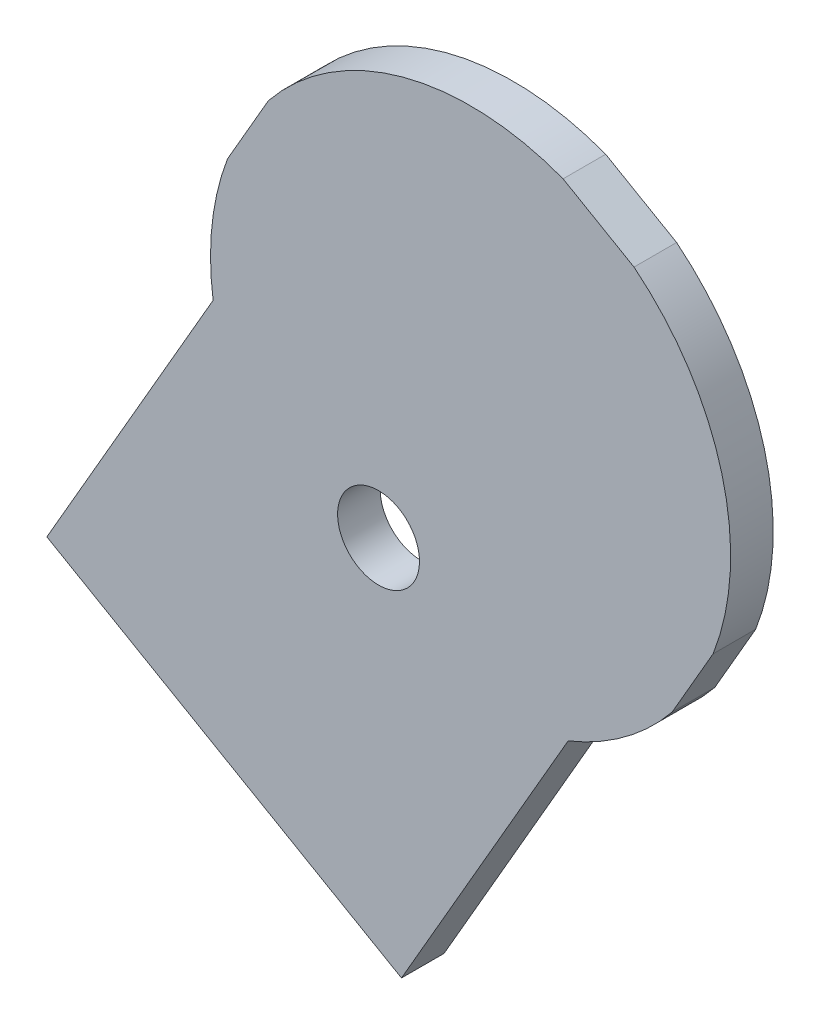
ISO-10303-21;
HEADER;
FILE_DESCRIPTION(('STEP AP214'),'2;1');
FILE_NAME('part.step','',(''),(''),'','','');
FILE_SCHEMA(('AUTOMOTIVE_DESIGN { 1 0 10303 214 1 1 1 1 }'));
ENDSEC;
DATA;
#1=APPLICATION_CONTEXT('core data for automotive mechanical design processes');
#2=APPLICATION_PROTOCOL_DEFINITION('international standard','automotive_design',2000,#1);
#3=PRODUCT_CONTEXT('',#1,'mechanical');
#4=PRODUCT('Part','Part','',(#3));
#5=PRODUCT_RELATED_PRODUCT_CATEGORY('part','',(#4));
#6=PRODUCT_DEFINITION_FORMATION('','',#4);
#7=PRODUCT_DEFINITION_CONTEXT('part definition',#1,'design');
#8=PRODUCT_DEFINITION('design','',#6,#7);
#9=PRODUCT_DEFINITION_SHAPE('','',#8);
#10=(LENGTH_UNIT() NAMED_UNIT(*) SI_UNIT(.MILLI.,.METRE.));
#11=(NAMED_UNIT(*) PLANE_ANGLE_UNIT() SI_UNIT($,.RADIAN.));
#12=(NAMED_UNIT(*) SI_UNIT($,.STERADIAN.) SOLID_ANGLE_UNIT());
#13=UNCERTAINTY_MEASURE_WITH_UNIT(LENGTH_MEASURE(1.E-05),#10,'distance_accuracy_value','');
#14=(GEOMETRIC_REPRESENTATION_CONTEXT(3) GLOBAL_UNCERTAINTY_ASSIGNED_CONTEXT((#13)) GLOBAL_UNIT_ASSIGNED_CONTEXT((#10,
#11,#12)) REPRESENTATION_CONTEXT('',''));
#15=CARTESIAN_POINT('',(0.,0.,0.));
#16=DIRECTION('',(0.,0.,1.));
#17=DIRECTION('',(1.,0.,0.));
#18=AXIS2_PLACEMENT_3D('',#15,#16,#17);
#19=CARTESIAN_POINT('',(-2.8575,-4.94933518262807,4.31801590579039));
#20=DIRECTION('',(0.,0.,-1.));
#21=DIRECTION('',(-0.866025403784438,0.5,0.));
#22=AXIS2_PLACEMENT_3D('',#19,#20,#21);
#23=CYLINDRICAL_SURFACE('',#22,1.27);
#24=CARTESIAN_POINT('',(-2.8575,-4.94933518262807,2.99721590579039));
#25=DIRECTION('',(0.,0.,1.));
#26=DIRECTION('',(0.866025403784438,-0.5,0.));
#27=AXIS2_PLACEMENT_3D('',#24,#25,#26);
#28=CIRCLE('',#27,1.27);
#29=CARTESIAN_POINT('',(-1.75764773719376,-5.58433518262807,2.99721590579039));
#30=VERTEX_POINT('',#29);
#31=EDGE_CURVE('E11',#30,#30,#28,.T.);
#32=ORIENTED_EDGE('',*,*,#31,.F.);
#33=EDGE_LOOP('',(#32));
#34=FACE_BOUND('',#33,.T.);
#35=CARTESIAN_POINT('',(-2.8575,-4.94933518262807,4.31801590579039));
#36=DIRECTION('',(0.,0.,1.));
#37=DIRECTION('',(0.866025403784438,-0.5,0.));
#38=AXIS2_PLACEMENT_3D('',#35,#36,#37);
#39=CIRCLE('',#38,1.27);
#40=CARTESIAN_POINT('',(-1.75764773719376,-5.58433518262807,4.31801590579039));
#41=VERTEX_POINT('',#40);
#42=EDGE_CURVE('E26',#41,#41,#39,.T.);
#43=ORIENTED_EDGE('',*,*,#42,.T.);
#44=EDGE_LOOP('',(#43));
#45=FACE_BOUND('',#44,.T.);
#46=ADVANCED_FACE('F17',(#34,#45),#23,.F.);
#47=CARTESIAN_POINT('',(-0.00245149196800009,-0.00424895034391575,2.99721590579039));
#48=DIRECTION('',(0.,0.,-1.));
#49=DIRECTION('',(-0.866025403784438,0.5,0.));
#50=AXIS2_PLACEMENT_3D('',#47,#48,#49);
#51=PLANE('',#50);
#52=DIRECTION('',(-0.5,-0.866025403784438,0.));
#53=VECTOR('',#52,1.);
#54=CARTESIAN_POINT('',(-7.98846131403119,-1.13642087020045,2.99721590579039));
#55=LINE('',#54,#53);
#56=CARTESIAN_POINT('',(-7.98846131403119,-1.13642087020045,2.99721590579039));
#57=VERTEX_POINT('',#56);
#58=CARTESIAN_POINT('',(-13.1446613140312,-10.0672212441871,2.99721590579039));
#59=VERTEX_POINT('',#58);
#60=EDGE_CURVE('E140',#57,#59,#55,.T.);
#61=ORIENTED_EDGE('',*,*,#60,.F.);
#62=CARTESIAN_POINT('',(0.0614355215099271,0.00761367946444508,2.99721590579039));
#63=DIRECTION('',(0.,0.,1.));
#64=DIRECTION('',(-0.866025403784438,0.5,0.));
#65=AXIS2_PLACEMENT_3D('',#62,#63,#64);
#66=CIRCLE('',#65,8.130784348);
#67=CARTESIAN_POINT('',(-7.54207221042317,2.88794773719377,2.99721590579039));
#68=VERTEX_POINT('',#67);
#69=EDGE_CURVE('E249',#68,#57,#66,.T.);
#70=ORIENTED_EDGE('',*,*,#69,.F.);
#71=DIRECTION('',(-0.5,-0.866025403784439,0.));
#72=VECTOR('',#71,1.);
#73=CARTESIAN_POINT('',(-6.27207221042317,5.08765226280624,2.99721590579039));
#74=LINE('',#73,#72);
#75=CARTESIAN_POINT('',(-6.27207221042317,5.08765226280624,2.99721590579039));
#76=VERTEX_POINT('',#75);
#77=EDGE_CURVE('E212',#76,#68,#74,.T.);
#78=ORIENTED_EDGE('',*,*,#77,.F.);
#79=CARTESIAN_POINT('',(-0.00224341417231671,0.0215153503733709,2.99721590579039));
#80=DIRECTION('',(0.,0.,1.));
#81=DIRECTION('',(0.866025403784438,-0.5,0.));
#82=AXIS2_PLACEMENT_3D('',#79,#80,#81);
#83=CIRCLE('',#82,8.060799982);
#84=CARTESIAN_POINT('',(2.86595069193764,7.55477221042317,2.99721590579039));
#85=VERTEX_POINT('',#84);
#86=EDGE_CURVE('E201',#85,#76,#83,.T.);
#87=ORIENTED_EDGE('',*,*,#86,.F.);
#88=DIRECTION('',(-0.866025403784438,0.5,0.));
#89=VECTOR('',#88,1.);
#90=CARTESIAN_POINT('',(2.86595069193764,7.55477221042317,2.99721590579039));
#91=LINE('',#90,#89);
#92=CARTESIAN_POINT('',(5.06565521755012,6.28477221042317,2.99721590579039));
#93=VERTEX_POINT('',#92);
#94=EDGE_CURVE('E193',#93,#85,#91,.T.);
#95=ORIENTED_EDGE('',*,*,#94,.F.);
#96=CARTESIAN_POINT('',(0.0300505108123441,0.0266461006165578,2.99721590579039));
#97=DIRECTION('',(0.,0.,1.));
#98=DIRECTION('',(-0.866025403784438,0.5,0.));
#99=AXIS2_PLACEMENT_3D('',#96,#97,#98);
#100=CIRCLE('',#99,8.032524956);
#101=CARTESIAN_POINT('',(7.52007516516704,-2.87524773719377,2.99721590579039));
#102=VERTEX_POINT('',#101);
#103=EDGE_CURVE('E185',#102,#93,#100,.T.);
#104=ORIENTED_EDGE('',*,*,#103,.F.);
#105=DIRECTION('',(0.5,0.866025403784438,0.));
#106=VECTOR('',#105,1.);
#107=CARTESIAN_POINT('',(7.52007516516704,-2.87524773719377,2.99721590579039));
#108=LINE('',#107,#106);
#109=CARTESIAN_POINT('',(6.25007516516704,-5.07495226280624,2.99721590579039));
#110=VERTEX_POINT('',#109);
#111=EDGE_CURVE('E177',#110,#102,#108,.T.);
#112=ORIENTED_EDGE('',*,*,#111,.F.);
#113=CARTESIAN_POINT('',(-0.00245149196800009,-0.00424895034391575,2.99721590579039));
#114=DIRECTION('',(0.,0.,1.));
#115=DIRECTION('',(-0.866025403784438,0.5,0.));
#116=AXIS2_PLACEMENT_3D('',#113,#114,#115);
#117=CIRCLE('',#116,8.050224946);
#118=CARTESIAN_POINT('',(3.02276131403118,-7.46442382494433,2.99721590579039));
#119=VERTEX_POINT('',#118);
#120=EDGE_CURVE('E169',#119,#110,#117,.T.);
#121=ORIENTED_EDGE('',*,*,#120,.F.);
#122=DIRECTION('',(0.5,0.866025403784438,0.));
#123=VECTOR('',#122,1.);
#124=CARTESIAN_POINT('',(-2.14613868596882,-16.4172212441871,2.99721590579039));
#125=LINE('',#124,#123);
#126=CARTESIAN_POINT('',(-2.14613868596882,-16.4172212441871,2.99721590579039));
#127=VERTEX_POINT('',#126);
#128=EDGE_CURVE('E127',#127,#119,#125,.T.);
#129=ORIENTED_EDGE('',*,*,#128,.F.);
#130=DIRECTION('',(0.866025403784438,-0.5,0.));
#131=VECTOR('',#130,1.);
#132=CARTESIAN_POINT('',(-13.1446613140312,-10.0672212441871,2.99721590579039));
#133=LINE('',#132,#131);
#134=EDGE_CURVE('E154',#59,#127,#133,.T.);
#135=ORIENTED_EDGE('',*,*,#134,.F.);
#136=EDGE_LOOP('',(#61,#70,#78,#87,#95,#104,#112,#121,#129,#135));
#137=FACE_BOUND('',#136,.T.);
#138=ORIENTED_EDGE('',*,*,#31,.T.);
#139=EDGE_LOOP('',(#138));
#140=FACE_BOUND('',#139,.T.);
#141=ADVANCED_FACE('F306',(#137,#140),#51,.T.);
#142=CARTESIAN_POINT('',(-0.00245149196800022,-0.00424895034391596,4.31801590579039));
#143=DIRECTION('',(0.,0.,-1.));
#144=DIRECTION('',(-0.866025403784438,0.5,0.));
#145=AXIS2_PLACEMENT_3D('',#142,#143,#144);
#146=PLANE('',#145);
#147=DIRECTION('',(-0.5,-0.866025403784438,0.));
#148=VECTOR('',#147,1.);
#149=CARTESIAN_POINT('',(-7.98846131403119,-1.13642087020045,4.31801590579039));
#150=LINE('',#149,#148);
#151=CARTESIAN_POINT('',(-7.98846131403119,-1.13642087020045,4.31801590579039));
#152=VERTEX_POINT('',#151);
#153=CARTESIAN_POINT('',(-13.1446613140312,-10.0672212441871,4.31801590579039));
#154=VERTEX_POINT('',#153);
#155=EDGE_CURVE('E130',#152,#154,#150,.T.);
#156=ORIENTED_EDGE('',*,*,#155,.T.);
#157=DIRECTION('',(0.866025403784438,-0.5,0.));
#158=VECTOR('',#157,1.);
#159=CARTESIAN_POINT('',(-13.1446613140312,-10.0672212441871,4.31801590579039));
#160=LINE('',#159,#158);
#161=CARTESIAN_POINT('',(-2.14613868596882,-16.4172212441871,4.31801590579039));
#162=VERTEX_POINT('',#161);
#163=EDGE_CURVE('E115',#154,#162,#160,.T.);
#164=ORIENTED_EDGE('',*,*,#163,.T.);
#165=DIRECTION('',(0.5,0.866025403784438,0.));
#166=VECTOR('',#165,1.);
#167=CARTESIAN_POINT('',(-2.14613868596882,-16.4172212441871,4.31801590579039));
#168=LINE('',#167,#166);
#169=CARTESIAN_POINT('',(3.02276131403118,-7.46442382494433,4.31801590579039));
#170=VERTEX_POINT('',#169);
#171=EDGE_CURVE('E161',#162,#170,#168,.T.);
#172=ORIENTED_EDGE('',*,*,#171,.T.);
#173=CARTESIAN_POINT('',(-0.00245149196800022,-0.00424895034391596,4.31801590579039));
#174=DIRECTION('',(0.,0.,1.));
#175=DIRECTION('',(-0.866025403784438,0.5,0.));
#176=AXIS2_PLACEMENT_3D('',#173,#174,#175);
#177=CIRCLE('',#176,8.050224946);
#178=CARTESIAN_POINT('',(6.25007516516704,-5.07495226280624,4.31801590579039));
#179=VERTEX_POINT('',#178);
#180=EDGE_CURVE('E168',#170,#179,#177,.T.);
#181=ORIENTED_EDGE('',*,*,#180,.T.);
#182=DIRECTION('',(0.5,0.866025403784438,0.));
#183=VECTOR('',#182,1.);
#184=CARTESIAN_POINT('',(7.52007516516704,-2.87524773719377,4.31801590579039));
#185=LINE('',#184,#183);
#186=CARTESIAN_POINT('',(7.52007516516704,-2.87524773719377,4.31801590579039));
#187=VERTEX_POINT('',#186);
#188=EDGE_CURVE('E176',#179,#187,#185,.T.);
#189=ORIENTED_EDGE('',*,*,#188,.T.);
#190=CARTESIAN_POINT('',(0.030050510812344,0.0266461006165576,4.31801590579039));
#191=DIRECTION('',(0.,0.,1.));
#192=DIRECTION('',(-0.866025403784438,0.5,0.));
#193=AXIS2_PLACEMENT_3D('',#190,#191,#192);
#194=CIRCLE('',#193,8.032524956);
#195=CARTESIAN_POINT('',(5.06565521755012,6.28477221042317,4.31801590579039));
#196=VERTEX_POINT('',#195);
#197=EDGE_CURVE('E184',#187,#196,#194,.T.);
#198=ORIENTED_EDGE('',*,*,#197,.T.);
#199=DIRECTION('',(-0.866025403784438,0.5,0.));
#200=VECTOR('',#199,1.);
#201=CARTESIAN_POINT('',(2.86595069193764,7.55477221042317,4.31801590579039));
#202=LINE('',#201,#200);
#203=CARTESIAN_POINT('',(2.86595069193764,7.55477221042317,4.31801590579039));
#204=VERTEX_POINT('',#203);
#205=EDGE_CURVE('E192',#196,#204,#202,.T.);
#206=ORIENTED_EDGE('',*,*,#205,.T.);
#207=CARTESIAN_POINT('',(-0.00224341417231683,0.0215153503733707,4.31801590579039));
#208=DIRECTION('',(0.,0.,1.));
#209=DIRECTION('',(0.866025403784438,-0.5,0.));
#210=AXIS2_PLACEMENT_3D('',#207,#208,#209);
#211=CIRCLE('',#210,8.060799982);
#212=CARTESIAN_POINT('',(-6.27207221042317,5.08765226280624,4.31801590579039));
#213=VERTEX_POINT('',#212);
#214=EDGE_CURVE('E200',#204,#213,#211,.T.);
#215=ORIENTED_EDGE('',*,*,#214,.T.);
#216=DIRECTION('',(-0.5,-0.866025403784439,0.));
#217=VECTOR('',#216,1.);
#218=CARTESIAN_POINT('',(-6.27207221042317,5.08765226280624,4.31801590579039));
#219=LINE('',#218,#217);
#220=CARTESIAN_POINT('',(-7.54207221042317,2.88794773719377,4.31801590579039));
#221=VERTEX_POINT('',#220);
#222=EDGE_CURVE('E211',#213,#221,#219,.T.);
#223=ORIENTED_EDGE('',*,*,#222,.T.);
#224=CARTESIAN_POINT('',(0.061435521509927,0.00761367946444487,4.31801590579039));
#225=DIRECTION('',(0.,0.,1.));
#226=DIRECTION('',(-0.866025403784438,0.5,0.));
#227=AXIS2_PLACEMENT_3D('',#224,#225,#226);
#228=CIRCLE('',#227,8.130784348);
#229=EDGE_CURVE('E36',#221,#152,#228,.T.);
#230=ORIENTED_EDGE('',*,*,#229,.T.);
#231=EDGE_LOOP('',(#156,#164,#172,#181,#189,#198,#206,#215,#223,#230));
#232=FACE_BOUND('',#231,.T.);
#233=ORIENTED_EDGE('',*,*,#42,.F.);
#234=EDGE_LOOP('',(#233));
#235=FACE_BOUND('',#234,.T.);
#236=ADVANCED_FACE('F131',(#232,#235),#146,.F.);
#237=CARTESIAN_POINT('',(0.061435521509927,0.00761367946444487,4.31801590579039));
#238=DIRECTION('',(0.,0.,-1.));
#239=DIRECTION('',(-0.866025403784438,0.5,0.));
#240=AXIS2_PLACEMENT_3D('',#237,#238,#239);
#241=CYLINDRICAL_SURFACE('',#240,8.130784348);
#242=ORIENTED_EDGE('',*,*,#69,.T.);
#243=DIRECTION('',(0.,0.,-1.));
#244=VECTOR('',#243,1.);
#245=CARTESIAN_POINT('',(-7.98846131403119,-1.13642087020045,4.31801590579039));
#246=LINE('',#245,#244);
#247=EDGE_CURVE('E136',#152,#57,#246,.T.);
#248=ORIENTED_EDGE('',*,*,#247,.F.);
#249=ORIENTED_EDGE('',*,*,#229,.F.);
#250=DIRECTION('',(0.,0.,-1.));
#251=VECTOR('',#250,1.);
#252=CARTESIAN_POINT('',(-7.54207221042317,2.88794773719377,4.31801590579039));
#253=LINE('',#252,#251);
#254=EDGE_CURVE('E208',#221,#68,#253,.T.);
#255=ORIENTED_EDGE('',*,*,#254,.T.);
#256=EDGE_LOOP('',(#242,#248,#249,#255));
#257=FACE_BOUND('',#256,.T.);
#258=ADVANCED_FACE('F305',(#257),#241,.T.);
#259=CARTESIAN_POINT('',(-6.27207221042317,5.08765226280624,4.31801590579039));
#260=DIRECTION('',(0.866025403784439,-0.5,0.));
#261=DIRECTION('',(0.5,0.866025403784439,0.));
#262=AXIS2_PLACEMENT_3D('',#259,#260,#261);
#263=PLANE('',#262);
#264=ORIENTED_EDGE('',*,*,#77,.T.);
#265=ORIENTED_EDGE('',*,*,#254,.F.);
#266=ORIENTED_EDGE('',*,*,#222,.F.);
#267=DIRECTION('',(0.,0.,-1.));
#268=VECTOR('',#267,1.);
#269=CARTESIAN_POINT('',(-6.27207221042317,5.08765226280624,4.31801590579039));
#270=LINE('',#269,#268);
#271=EDGE_CURVE('E196',#213,#76,#270,.T.);
#272=ORIENTED_EDGE('',*,*,#271,.T.);
#273=EDGE_LOOP('',(#264,#265,#266,#272));
#274=FACE_BOUND('',#273,.T.);
#275=ADVANCED_FACE('F312',(#274),#263,.F.);
#276=CARTESIAN_POINT('',(-0.00224341417231683,0.0215153503733707,4.31801590579039));
#277=DIRECTION('',(0.,0.,-1.));
#278=DIRECTION('',(-0.866025403784438,0.5,0.));
#279=AXIS2_PLACEMENT_3D('',#276,#277,#278);
#280=CYLINDRICAL_SURFACE('',#279,8.060799982);
#281=ORIENTED_EDGE('',*,*,#86,.T.);
#282=ORIENTED_EDGE('',*,*,#271,.F.);
#283=ORIENTED_EDGE('',*,*,#214,.F.);
#284=DIRECTION('',(0.,0.,-1.));
#285=VECTOR('',#284,1.);
#286=CARTESIAN_POINT('',(2.86595069193764,7.55477221042317,4.31801590579039));
#287=LINE('',#286,#285);
#288=EDGE_CURVE('E188',#204,#85,#287,.T.);
#289=ORIENTED_EDGE('',*,*,#288,.T.);
#290=EDGE_LOOP('',(#281,#282,#283,#289));
#291=FACE_BOUND('',#290,.T.);
#292=ADVANCED_FACE('F348',(#291),#280,.T.);
#293=CARTESIAN_POINT('',(2.86595069193764,7.55477221042317,4.31801590579039));
#294=DIRECTION('',(-0.5,-0.866025403784438,0.));
#295=DIRECTION('',(0.,0.,-1.));
#296=AXIS2_PLACEMENT_3D('',#293,#294,#295);
#297=PLANE('',#296);
#298=ORIENTED_EDGE('',*,*,#94,.T.);
#299=ORIENTED_EDGE('',*,*,#288,.F.);
#300=ORIENTED_EDGE('',*,*,#205,.F.);
#301=DIRECTION('',(0.,0.,-1.));
#302=VECTOR('',#301,1.);
#303=CARTESIAN_POINT('',(5.06565521755012,6.28477221042317,4.31801590579039));
#304=LINE('',#303,#302);
#305=EDGE_CURVE('E180',#196,#93,#304,.T.);
#306=ORIENTED_EDGE('',*,*,#305,.T.);
#307=EDGE_LOOP('',(#298,#299,#300,#306));
#308=FACE_BOUND('',#307,.T.);
#309=ADVANCED_FACE('F358',(#308),#297,.F.);
#310=CARTESIAN_POINT('',(0.030050510812344,0.0266461006165576,4.31801590579039));
#311=DIRECTION('',(0.,0.,-1.));
#312=DIRECTION('',(-0.866025403784438,0.5,0.));
#313=AXIS2_PLACEMENT_3D('',#310,#311,#312);
#314=CYLINDRICAL_SURFACE('',#313,8.032524956);
#315=ORIENTED_EDGE('',*,*,#103,.T.);
#316=ORIENTED_EDGE('',*,*,#305,.F.);
#317=ORIENTED_EDGE('',*,*,#197,.F.);
#318=DIRECTION('',(0.,0.,-1.));
#319=VECTOR('',#318,1.);
#320=CARTESIAN_POINT('',(7.52007516516704,-2.87524773719377,4.31801590579039));
#321=LINE('',#320,#319);
#322=EDGE_CURVE('E172',#187,#102,#321,.T.);
#323=ORIENTED_EDGE('',*,*,#322,.T.);
#324=EDGE_LOOP('',(#315,#316,#317,#323));
#325=FACE_BOUND('',#324,.T.);
#326=ADVANCED_FACE('F368',(#325),#314,.T.);
#327=CARTESIAN_POINT('',(7.52007516516704,-2.87524773719377,4.31801590579039));
#328=DIRECTION('',(-0.866025403784438,0.5,0.));
#329=DIRECTION('',(-0.5,-0.866025403784438,0.));
#330=AXIS2_PLACEMENT_3D('',#327,#328,#329);
#331=PLANE('',#330);
#332=ORIENTED_EDGE('',*,*,#111,.T.);
#333=ORIENTED_EDGE('',*,*,#322,.F.);
#334=ORIENTED_EDGE('',*,*,#188,.F.);
#335=DIRECTION('',(0.,0.,-1.));
#336=VECTOR('',#335,1.);
#337=CARTESIAN_POINT('',(6.25007516516704,-5.07495226280624,4.31801590579039));
#338=LINE('',#337,#336);
#339=EDGE_CURVE('E164',#179,#110,#338,.T.);
#340=ORIENTED_EDGE('',*,*,#339,.T.);
#341=EDGE_LOOP('',(#332,#333,#334,#340));
#342=FACE_BOUND('',#341,.T.);
#343=ADVANCED_FACE('F378',(#342),#331,.F.);
#344=CARTESIAN_POINT('',(-0.00245149196800022,-0.00424895034391596,4.31801590579039));
#345=DIRECTION('',(0.,0.,-1.));
#346=DIRECTION('',(-0.866025403784438,0.5,0.));
#347=AXIS2_PLACEMENT_3D('',#344,#345,#346);
#348=CYLINDRICAL_SURFACE('',#347,8.050224946);
#349=ORIENTED_EDGE('',*,*,#120,.T.);
#350=ORIENTED_EDGE('',*,*,#339,.F.);
#351=ORIENTED_EDGE('',*,*,#180,.F.);
#352=DIRECTION('',(0.,0.,-1.));
#353=VECTOR('',#352,1.);
#354=CARTESIAN_POINT('',(3.02276131403118,-7.46442382494433,4.31801590579039));
#355=LINE('',#354,#353);
#356=EDGE_CURVE('E157',#170,#119,#355,.T.);
#357=ORIENTED_EDGE('',*,*,#356,.T.);
#358=EDGE_LOOP('',(#349,#350,#351,#357));
#359=FACE_BOUND('',#358,.T.);
#360=ADVANCED_FACE('F388',(#359),#348,.T.);
#361=CARTESIAN_POINT('',(-2.14613868596882,-16.4172212441871,4.31801590579039));
#362=DIRECTION('',(-0.866025403784438,0.5,0.));
#363=DIRECTION('',(0.,0.,1.));
#364=AXIS2_PLACEMENT_3D('',#361,#362,#363);
#365=PLANE('',#364);
#366=ORIENTED_EDGE('',*,*,#128,.T.);
#367=ORIENTED_EDGE('',*,*,#356,.F.);
#368=ORIENTED_EDGE('',*,*,#171,.F.);
#369=DIRECTION('',(0.,0.,-1.));
#370=VECTOR('',#369,1.);
#371=CARTESIAN_POINT('',(-2.14613868596882,-16.4172212441871,4.31801590579039));
#372=LINE('',#371,#370);
#373=EDGE_CURVE('E123',#162,#127,#372,.T.);
#374=ORIENTED_EDGE('',*,*,#373,.T.);
#375=EDGE_LOOP('',(#366,#367,#368,#374));
#376=FACE_BOUND('',#375,.T.);
#377=ADVANCED_FACE('F398',(#376),#365,.F.);
#378=CARTESIAN_POINT('',(-13.1446613140312,-10.0672212441871,4.31801590579039));
#379=DIRECTION('',(0.5,0.866025403784438,0.));
#380=DIRECTION('',(0.,0.,1.));
#381=AXIS2_PLACEMENT_3D('',#378,#379,#380);
#382=PLANE('',#381);
#383=ORIENTED_EDGE('',*,*,#134,.T.);
#384=ORIENTED_EDGE('',*,*,#373,.F.);
#385=ORIENTED_EDGE('',*,*,#163,.F.);
#386=DIRECTION('',(0.,0.,-1.));
#387=VECTOR('',#386,1.);
#388=CARTESIAN_POINT('',(-13.1446613140312,-10.0672212441871,4.31801590579039));
#389=LINE('',#388,#387);
#390=EDGE_CURVE('E120',#154,#59,#389,.T.);
#391=ORIENTED_EDGE('',*,*,#390,.T.);
#392=EDGE_LOOP('',(#383,#384,#385,#391));
#393=FACE_BOUND('',#392,.T.);
#394=ADVANCED_FACE('F118',(#393),#382,.F.);
#395=CARTESIAN_POINT('',(-7.98846131403119,-1.13642087020045,4.31801590579039));
#396=DIRECTION('',(0.866025403784438,-0.5,0.));
#397=DIRECTION('',(0.,0.,-1.));
#398=AXIS2_PLACEMENT_3D('',#395,#396,#397);
#399=PLANE('',#398);
#400=ORIENTED_EDGE('',*,*,#60,.T.);
#401=ORIENTED_EDGE('',*,*,#390,.F.);
#402=ORIENTED_EDGE('',*,*,#155,.F.);
#403=ORIENTED_EDGE('',*,*,#247,.T.);
#404=EDGE_LOOP('',(#400,#401,#402,#403));
#405=FACE_BOUND('',#404,.T.);
#406=ADVANCED_FACE('F138',(#405),#399,.F.);
#407=CLOSED_SHELL('',(#46,#141,#236,#258,#275,#292,#309,#326,#343,#360,#377,#394,#406));
#408=MANIFOLD_SOLID_BREP('B1',#407);
#409=ADVANCED_BREP_SHAPE_REPRESENTATION('',(#18,#408),#14);
#410=SHAPE_DEFINITION_REPRESENTATION(#9,#409);
ENDSEC;
END-ISO-10303-21;
